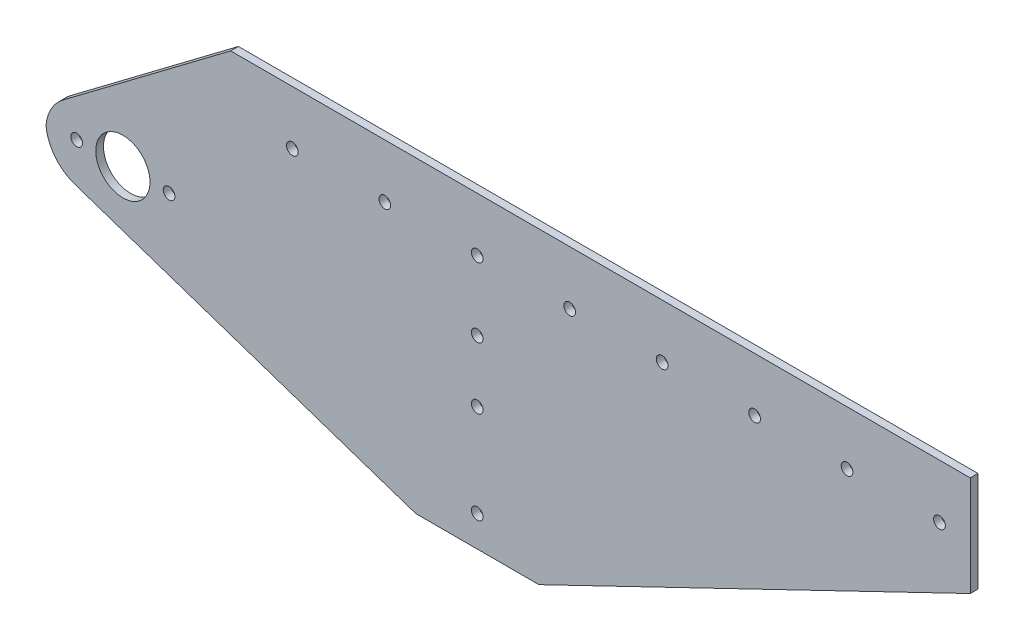
ISO-10303-21;
HEADER;
FILE_DESCRIPTION(('STEP AP214'),'2;1');
FILE_NAME('part.step','',(''),(''),'','','');
FILE_SCHEMA(('AUTOMOTIVE_DESIGN { 1 0 10303 214 1 1 1 1 }'));
ENDSEC;
DATA;
#1=APPLICATION_CONTEXT('core data for automotive mechanical design processes');
#2=APPLICATION_PROTOCOL_DEFINITION('international standard','automotive_design',2000,#1);
#3=PRODUCT_CONTEXT('',#1,'mechanical');
#4=PRODUCT('Part','Part','',(#3));
#5=PRODUCT_RELATED_PRODUCT_CATEGORY('part','',(#4));
#6=PRODUCT_DEFINITION_FORMATION('','',#4);
#7=PRODUCT_DEFINITION_CONTEXT('part definition',#1,'design');
#8=PRODUCT_DEFINITION('design','',#6,#7);
#9=PRODUCT_DEFINITION_SHAPE('','',#8);
#10=(LENGTH_UNIT() NAMED_UNIT(*) SI_UNIT(.MILLI.,.METRE.));
#11=(NAMED_UNIT(*) PLANE_ANGLE_UNIT() SI_UNIT($,.RADIAN.));
#12=(NAMED_UNIT(*) SI_UNIT($,.STERADIAN.) SOLID_ANGLE_UNIT());
#13=UNCERTAINTY_MEASURE_WITH_UNIT(LENGTH_MEASURE(1.E-05),#10,'distance_accuracy_value','');
#14=(GEOMETRIC_REPRESENTATION_CONTEXT(3) GLOBAL_UNCERTAINTY_ASSIGNED_CONTEXT((#13)) GLOBAL_UNIT_ASSIGNED_CONTEXT((#10,
#11,#12)) REPRESENTATION_CONTEXT('',''));
#15=CARTESIAN_POINT('',(0.,0.,0.));
#16=DIRECTION('',(0.,0.,1.));
#17=DIRECTION('',(1.,0.,0.));
#18=AXIS2_PLACEMENT_3D('',#15,#16,#17);
#19=CARTESIAN_POINT('',(-228.6,-127.,3.175));
#20=DIRECTION('',(0.318881014266664,0.947794755598628,0.));
#21=DIRECTION('',(-0.947794755598628,0.318881014266664,0.));
#22=AXIS2_PLACEMENT_3D('',#19,#20,#21);
#23=PLANE('',#22);
#24=DIRECTION('',(0.947794755598628,-0.318881014266664,0.));
#25=VECTOR('',#24,1.);
#26=CARTESIAN_POINT('',(-228.6,-127.,3.175));
#27=LINE('',#26,#25);
#28=CARTESIAN_POINT('',(-368.998683471379,-79.7635341696098,3.175));
#29=VERTEX_POINT('',#28);
#30=CARTESIAN_POINT('',(-228.6,-127.,3.175));
#31=VERTEX_POINT('',#30);
#32=EDGE_CURVE('E103',#29,#31,#27,.T.);
#33=ORIENTED_EDGE('',*,*,#32,.F.);
#34=DIRECTION('',(0.,0.,-1.));
#35=VECTOR('',#34,1.);
#36=CARTESIAN_POINT('',(-368.998683471379,-79.7635341696098,3.175));
#37=LINE('',#36,#35);
#38=CARTESIAN_POINT('',(-368.998683471379,-79.7635341696098,0.));
#39=VERTEX_POINT('',#38);
#40=EDGE_CURVE('E158',#29,#39,#37,.T.);
#41=ORIENTED_EDGE('',*,*,#40,.T.);
#42=DIRECTION('',(0.947794755598628,-0.318881014266664,0.));
#43=VECTOR('',#42,1.);
#44=CARTESIAN_POINT('',(-228.6,-127.,0.));
#45=LINE('',#44,#43);
#46=CARTESIAN_POINT('',(-228.6,-127.,0.));
#47=VERTEX_POINT('',#46);
#48=EDGE_CURVE('E118',#39,#47,#45,.T.);
#49=ORIENTED_EDGE('',*,*,#48,.T.);
#50=DIRECTION('',(0.,0.,-1.));
#51=VECTOR('',#50,1.);
#52=CARTESIAN_POINT('',(-228.6,-127.,3.175));
#53=LINE('',#52,#51);
#54=EDGE_CURVE('E116',#31,#47,#53,.T.);
#55=ORIENTED_EDGE('',*,*,#54,.F.);
#56=EDGE_LOOP('',(#33,#41,#49,#55));
#57=FACE_BOUND('',#56,.T.);
#58=ADVANCED_FACE('F39',(#57),#23,.F.);
#59=CARTESIAN_POINT('',(-177.8,-127.,3.175));
#60=DIRECTION('',(0.,1.,0.));
#61=DIRECTION('',(0.,0.,1.));
#62=AXIS2_PLACEMENT_3D('',#59,#60,#61);
#63=PLANE('',#62);
#64=DIRECTION('',(1.,0.,0.));
#65=VECTOR('',#64,1.);
#66=CARTESIAN_POINT('',(-177.8,-127.,0.));
#67=LINE('',#66,#65);
#68=CARTESIAN_POINT('',(-177.8,-127.,0.));
#69=VERTEX_POINT('',#68);
#70=EDGE_CURVE('E137',#47,#69,#67,.T.);
#71=ORIENTED_EDGE('',*,*,#70,.T.);
#72=DIRECTION('',(0.,0.,-1.));
#73=VECTOR('',#72,1.);
#74=CARTESIAN_POINT('',(-177.8,-127.,3.175));
#75=LINE('',#74,#73);
#76=CARTESIAN_POINT('',(-177.8,-127.,3.175));
#77=VERTEX_POINT('',#76);
#78=EDGE_CURVE('E122',#77,#69,#75,.T.);
#79=ORIENTED_EDGE('',*,*,#78,.F.);
#80=DIRECTION('',(1.,0.,0.));
#81=VECTOR('',#80,1.);
#82=CARTESIAN_POINT('',(-177.8,-127.,3.175));
#83=LINE('',#82,#81);
#84=EDGE_CURVE('E107',#31,#77,#83,.T.);
#85=ORIENTED_EDGE('',*,*,#84,.F.);
#86=ORIENTED_EDGE('',*,*,#54,.T.);
#87=EDGE_LOOP('',(#71,#79,#85,#86));
#88=FACE_BOUND('',#87,.T.);
#89=ADVANCED_FACE('F124',(#88),#63,.F.);
#90=CARTESIAN_POINT('',(0.,-41.275,3.175));
#91=DIRECTION('',(-0.434299185660003,0.900768681368895,0.));
#92=DIRECTION('',(-0.900768681368895,-0.434299185660003,0.));
#93=AXIS2_PLACEMENT_3D('',#90,#91,#92);
#94=PLANE('',#93);
#95=DIRECTION('',(0.900768681368895,0.434299185660003,0.));
#96=VECTOR('',#95,1.);
#97=CARTESIAN_POINT('',(0.,-41.275,0.));
#98=LINE('',#97,#96);
#99=CARTESIAN_POINT('',(0.,-41.275,0.));
#100=VERTEX_POINT('',#99);
#101=EDGE_CURVE('E140',#69,#100,#98,.T.);
#102=ORIENTED_EDGE('',*,*,#101,.T.);
#103=DIRECTION('',(0.,0.,-1.));
#104=VECTOR('',#103,1.);
#105=CARTESIAN_POINT('',(0.,-41.275,3.175));
#106=LINE('',#105,#104);
#107=CARTESIAN_POINT('',(0.,-41.275,3.175));
#108=VERTEX_POINT('',#107);
#109=EDGE_CURVE('E149',#108,#100,#106,.T.);
#110=ORIENTED_EDGE('',*,*,#109,.F.);
#111=DIRECTION('',(0.900768681368895,0.434299185660003,0.));
#112=VECTOR('',#111,1.);
#113=CARTESIAN_POINT('',(0.,-41.275,3.175));
#114=LINE('',#113,#112);
#115=EDGE_CURVE('E127',#77,#108,#114,.T.);
#116=ORIENTED_EDGE('',*,*,#115,.F.);
#117=ORIENTED_EDGE('',*,*,#78,.T.);
#118=EDGE_LOOP('',(#102,#110,#116,#117));
#119=FACE_BOUND('',#118,.T.);
#120=ADVANCED_FACE('F271',(#119),#94,.F.);
#121=CARTESIAN_POINT('',(0.,0.,3.175));
#122=DIRECTION('',(-1.,0.,0.));
#123=DIRECTION('',(0.,-1.,0.));
#124=AXIS2_PLACEMENT_3D('',#121,#122,#123);
#125=PLANE('',#124);
#126=DIRECTION('',(0.,1.,0.));
#127=VECTOR('',#126,1.);
#128=CARTESIAN_POINT('',(0.,0.,0.));
#129=LINE('',#128,#127);
#130=CARTESIAN_POINT('',(0.,0.,0.));
#131=VERTEX_POINT('',#130);
#132=EDGE_CURVE('E142',#100,#131,#129,.T.);
#133=ORIENTED_EDGE('',*,*,#132,.T.);
#134=DIRECTION('',(0.,0.,-1.));
#135=VECTOR('',#134,1.);
#136=CARTESIAN_POINT('',(0.,0.,3.175));
#137=LINE('',#136,#135);
#138=CARTESIAN_POINT('',(0.,0.,3.175));
#139=VERTEX_POINT('',#138);
#140=EDGE_CURVE('E135',#139,#131,#137,.T.);
#141=ORIENTED_EDGE('',*,*,#140,.F.);
#142=DIRECTION('',(0.,1.,0.));
#143=VECTOR('',#142,1.);
#144=CARTESIAN_POINT('',(0.,0.,3.175));
#145=LINE('',#144,#143);
#146=EDGE_CURVE('E129',#108,#139,#145,.T.);
#147=ORIENTED_EDGE('',*,*,#146,.F.);
#148=ORIENTED_EDGE('',*,*,#109,.T.);
#149=EDGE_LOOP('',(#133,#141,#147,#148));
#150=FACE_BOUND('',#149,.T.);
#151=ADVANCED_FACE('F268',(#150),#125,.F.);
#152=CARTESIAN_POINT('',(-304.8,0.,3.175));
#153=DIRECTION('',(0.,-1.,0.));
#154=DIRECTION('',(0.,0.,-1.));
#155=AXIS2_PLACEMENT_3D('',#152,#153,#154);
#156=PLANE('',#155);
#157=DIRECTION('',(-1.,0.,0.));
#158=VECTOR('',#157,1.);
#159=CARTESIAN_POINT('',(-304.8,0.,0.));
#160=LINE('',#159,#158);
#161=CARTESIAN_POINT('',(-304.8,0.,0.));
#162=VERTEX_POINT('',#161);
#163=EDGE_CURVE('E144',#131,#162,#160,.T.);
#164=ORIENTED_EDGE('',*,*,#163,.T.);
#165=DIRECTION('',(0.,0.,1.));
#166=VECTOR('',#165,1.);
#167=CARTESIAN_POINT('',(-304.8,0.,3.175));
#168=LINE('',#167,#166);
#169=CARTESIAN_POINT('',(-304.8,0.,3.175));
#170=VERTEX_POINT('',#169);
#171=EDGE_CURVE('E154',#162,#170,#168,.T.);
#172=ORIENTED_EDGE('',*,*,#171,.T.);
#173=DIRECTION('',(-1.,0.,0.));
#174=VECTOR('',#173,1.);
#175=CARTESIAN_POINT('',(-381.,0.,3.175));
#176=LINE('',#175,#174);
#177=EDGE_CURVE('E113',#139,#170,#176,.T.);
#178=ORIENTED_EDGE('',*,*,#177,.F.);
#179=ORIENTED_EDGE('',*,*,#140,.T.);
#180=EDGE_LOOP('',(#164,#172,#178,#179));
#181=FACE_BOUND('',#180,.T.);
#182=ADVANCED_FACE('F263',(#181),#156,.F.);
#183=CARTESIAN_POINT('',(0.,0.,3.175));
#184=DIRECTION('',(0.,0.,-1.));
#185=DIRECTION('',(-1.,0.,0.));
#186=AXIS2_PLACEMENT_3D('',#183,#184,#185);
#187=PLANE('',#186);
#188=CARTESIAN_POINT('',(-368.3,-63.5,3.175));
#189=DIRECTION('',(0.,0.,1.));
#190=DIRECTION('',(1.,0.,0.));
#191=AXIS2_PLACEMENT_3D('',#188,#189,#190);
#192=CIRCLE('',#191,2.41299999999999);
#193=CARTESIAN_POINT('',(-365.887,-63.5,3.175));
#194=VERTEX_POINT('',#193);
#195=EDGE_CURVE('E178',#194,#194,#192,.T.);
#196=ORIENTED_EDGE('',*,*,#195,.F.);
#197=EDGE_LOOP('',(#196));
#198=FACE_BOUND('',#197,.T.);
#199=CARTESIAN_POINT('',(-330.2,-63.5,3.175));
#200=DIRECTION('',(0.,0.,1.));
#201=DIRECTION('',(1.,0.,0.));
#202=AXIS2_PLACEMENT_3D('',#199,#200,#201);
#203=CIRCLE('',#202,2.41299999999999);
#204=CARTESIAN_POINT('',(-327.787,-63.5,3.175));
#205=VERTEX_POINT('',#204);
#206=EDGE_CURVE('E183',#205,#205,#203,.T.);
#207=ORIENTED_EDGE('',*,*,#206,.F.);
#208=EDGE_LOOP('',(#207));
#209=FACE_BOUND('',#208,.T.);
#210=CARTESIAN_POINT('',(-349.25,-63.5,3.175));
#211=DIRECTION('',(0.,0.,1.));
#212=DIRECTION('',(1.,0.,0.));
#213=AXIS2_PLACEMENT_3D('',#210,#211,#212);
#214=CIRCLE('',#213,11.176);
#215=CARTESIAN_POINT('',(-338.074,-63.5,3.175));
#216=VERTEX_POINT('',#215);
#217=EDGE_CURVE('E193',#216,#216,#214,.T.);
#218=ORIENTED_EDGE('',*,*,#217,.F.);
#219=EDGE_LOOP('',(#218));
#220=FACE_BOUND('',#219,.T.);
#221=CARTESIAN_POINT('',(-50.8,-22.2250000000004,3.175));
#222=DIRECTION('',(0.,0.,1.));
#223=DIRECTION('',(1.,0.,0.));
#224=AXIS2_PLACEMENT_3D('',#221,#222,#223);
#225=CIRCLE('',#224,2.413);
#226=CARTESIAN_POINT('',(-48.387,-22.2250000000004,3.175));
#227=VERTEX_POINT('',#226);
#228=EDGE_CURVE('E172',#227,#227,#225,.T.);
#229=ORIENTED_EDGE('',*,*,#228,.F.);
#230=EDGE_LOOP('',(#229));
#231=FACE_BOUND('',#230,.T.);
#232=CARTESIAN_POINT('',(-203.2,-114.3,3.175));
#233=DIRECTION('',(0.,0.,1.));
#234=DIRECTION('',(1.,0.,0.));
#235=AXIS2_PLACEMENT_3D('',#232,#233,#234);
#236=CIRCLE('',#235,2.41299999999999);
#237=CARTESIAN_POINT('',(-200.787,-114.3,3.175));
#238=VERTEX_POINT('',#237);
#239=EDGE_CURVE('E207',#238,#238,#236,.T.);
#240=ORIENTED_EDGE('',*,*,#239,.F.);
#241=EDGE_LOOP('',(#240));
#242=FACE_BOUND('',#241,.T.);
#243=CARTESIAN_POINT('',(-203.2,-76.2,3.175));
#244=DIRECTION('',(0.,0.,1.));
#245=DIRECTION('',(1.,0.,0.));
#246=AXIS2_PLACEMENT_3D('',#243,#244,#245);
#247=CIRCLE('',#246,2.41299999999999);
#248=CARTESIAN_POINT('',(-200.787,-76.2,3.175));
#249=VERTEX_POINT('',#248);
#250=EDGE_CURVE('E201',#249,#249,#247,.T.);
#251=ORIENTED_EDGE('',*,*,#250,.F.);
#252=EDGE_LOOP('',(#251));
#253=FACE_BOUND('',#252,.T.);
#254=CARTESIAN_POINT('',(-12.7,-22.2250000000001,3.175));
#255=DIRECTION('',(0.,0.,1.));
#256=DIRECTION('',(1.,0.,0.));
#257=AXIS2_PLACEMENT_3D('',#254,#255,#256);
#258=CIRCLE('',#257,2.413);
#259=CARTESIAN_POINT('',(-10.287,-22.2250000000001,3.175));
#260=VERTEX_POINT('',#259);
#261=EDGE_CURVE('E200',#260,#260,#258,.T.);
#262=ORIENTED_EDGE('',*,*,#261,.F.);
#263=EDGE_LOOP('',(#262));
#264=FACE_BOUND('',#263,.T.);
#265=CARTESIAN_POINT('',(-88.9,-22.2250000000006,3.175));
#266=DIRECTION('',(0.,0.,1.));
#267=DIRECTION('',(1.,0.,0.));
#268=AXIS2_PLACEMENT_3D('',#265,#266,#267);
#269=CIRCLE('',#268,2.41300000000001);
#270=CARTESIAN_POINT('',(-86.487,-22.2250000000006,3.175));
#271=VERTEX_POINT('',#270);
#272=EDGE_CURVE('E250',#271,#271,#269,.T.);
#273=ORIENTED_EDGE('',*,*,#272,.F.);
#274=EDGE_LOOP('',(#273));
#275=FACE_BOUND('',#274,.T.);
#276=CARTESIAN_POINT('',(-127.,-22.2250000000009,3.175));
#277=DIRECTION('',(0.,0.,1.));
#278=DIRECTION('',(1.,0.,0.));
#279=AXIS2_PLACEMENT_3D('',#276,#277,#278);
#280=CIRCLE('',#279,2.413);
#281=CARTESIAN_POINT('',(-124.587,-22.2250000000009,3.175));
#282=VERTEX_POINT('',#281);
#283=EDGE_CURVE('E244',#282,#282,#280,.T.);
#284=ORIENTED_EDGE('',*,*,#283,.F.);
#285=EDGE_LOOP('',(#284));
#286=FACE_BOUND('',#285,.T.);
#287=CARTESIAN_POINT('',(-165.1,-22.2250000000012,3.175));
#288=DIRECTION('',(0.,0.,1.));
#289=DIRECTION('',(1.,0.,0.));
#290=AXIS2_PLACEMENT_3D('',#287,#288,#289);
#291=CIRCLE('',#290,2.413);
#292=CARTESIAN_POINT('',(-162.687,-22.2250000000012,3.175));
#293=VERTEX_POINT('',#292);
#294=EDGE_CURVE('E238',#293,#293,#291,.T.);
#295=ORIENTED_EDGE('',*,*,#294,.F.);
#296=EDGE_LOOP('',(#295));
#297=FACE_BOUND('',#296,.T.);
#298=CARTESIAN_POINT('',(-203.2,-50.8,3.175));
#299=DIRECTION('',(0.,0.,1.));
#300=DIRECTION('',(1.,0.,0.));
#301=AXIS2_PLACEMENT_3D('',#298,#299,#300);
#302=CIRCLE('',#301,2.41299999999999);
#303=CARTESIAN_POINT('',(-200.787,-50.8,3.175));
#304=VERTEX_POINT('',#303);
#305=EDGE_CURVE('E232',#304,#304,#302,.T.);
#306=ORIENTED_EDGE('',*,*,#305,.F.);
#307=EDGE_LOOP('',(#306));
#308=FACE_BOUND('',#307,.T.);
#309=CARTESIAN_POINT('',(-203.2,-22.225,3.175));
#310=DIRECTION('',(0.,0.,1.));
#311=DIRECTION('',(1.,0.,0.));
#312=AXIS2_PLACEMENT_3D('',#309,#310,#311);
#313=CIRCLE('',#312,2.413);
#314=CARTESIAN_POINT('',(-200.787,-22.225,3.175));
#315=VERTEX_POINT('',#314);
#316=EDGE_CURVE('E226',#315,#315,#313,.T.);
#317=ORIENTED_EDGE('',*,*,#316,.F.);
#318=EDGE_LOOP('',(#317));
#319=FACE_BOUND('',#318,.T.);
#320=CARTESIAN_POINT('',(-241.3,-22.2250000000017,3.175));
#321=DIRECTION('',(0.,0.,1.));
#322=DIRECTION('',(1.,0.,0.));
#323=AXIS2_PLACEMENT_3D('',#320,#321,#322);
#324=CIRCLE('',#323,2.413);
#325=CARTESIAN_POINT('',(-238.887,-22.2250000000017,3.175));
#326=VERTEX_POINT('',#325);
#327=EDGE_CURVE('E220',#326,#326,#324,.T.);
#328=ORIENTED_EDGE('',*,*,#327,.F.);
#329=EDGE_LOOP('',(#328));
#330=FACE_BOUND('',#329,.T.);
#331=CARTESIAN_POINT('',(-279.4,-22.225000000002,3.175));
#332=DIRECTION('',(0.,0.,1.));
#333=DIRECTION('',(1.,0.,0.));
#334=AXIS2_PLACEMENT_3D('',#331,#332,#333);
#335=CIRCLE('',#334,2.413);
#336=CARTESIAN_POINT('',(-276.987,-22.225000000002,3.175));
#337=VERTEX_POINT('',#336);
#338=EDGE_CURVE('E214',#337,#337,#335,.T.);
#339=ORIENTED_EDGE('',*,*,#338,.F.);
#340=EDGE_LOOP('',(#339));
#341=FACE_BOUND('',#340,.T.);
#342=CARTESIAN_POINT('',(-363.38,-66.2058265517345,3.175));
#343=DIRECTION('',(0.,0.,-1.));
#344=DIRECTION('',(-1.,0.,0.));
#345=AXIS2_PLACEMENT_3D('',#342,#343,#344);
#346=CIRCLE('',#345,17.62);
#347=CARTESIAN_POINT('',(-373.983980707939,-52.1338688647011,3.175));
#348=VERTEX_POINT('',#347);
#349=CARTESIAN_POINT('',(-380.929805526972,-64.6346085638482,3.175));
#350=VERTEX_POINT('',#349);
#351=EDGE_CURVE('E55',#348,#350,#346,.F.);
#352=ORIENTED_EDGE('',*,*,#351,.T.);
#353=CARTESIAN_POINT('',(-363.38,-63.063390575962,3.175));
#354=DIRECTION('',(0.,0.,-1.));
#355=DIRECTION('',(-1.,0.,0.));
#356=AXIS2_PLACEMENT_3D('',#353,#354,#355);
#357=CIRCLE('',#356,17.62);
#358=EDGE_CURVE('E48',#350,#29,#357,.F.);
#359=ORIENTED_EDGE('',*,*,#358,.T.);
#360=ORIENTED_EDGE('',*,*,#32,.T.);
#361=ORIENTED_EDGE('',*,*,#84,.T.);
#362=ORIENTED_EDGE('',*,*,#115,.T.);
#363=ORIENTED_EDGE('',*,*,#146,.T.);
#364=ORIENTED_EDGE('',*,*,#177,.T.);
#365=DIRECTION('',(0.798635510047294,0.601815023152047,0.));
#366=VECTOR('',#365,1.);
#367=CARTESIAN_POINT('',(-381.,-57.420818617833,3.175));
#368=LINE('',#367,#366);
#369=EDGE_CURVE('E156',#170,#348,#368,.F.);
#370=ORIENTED_EDGE('',*,*,#369,.T.);
#371=EDGE_LOOP('',(#352,#359,#360,#361,#362,#363,#364,#370));
#372=FACE_BOUND('',#371,.T.);
#373=ADVANCED_FACE('F105',(#198,#209,#220,#231,#242,#253,#264,#275,#286,#297,#308,#319,#330,
#341,#372),#187,.F.);
#374=CARTESIAN_POINT('',(0.,0.,0.));
#375=DIRECTION('',(0.,0.,-1.));
#376=DIRECTION('',(-1.,0.,0.));
#377=AXIS2_PLACEMENT_3D('',#374,#375,#376);
#378=PLANE('',#377);
#379=CARTESIAN_POINT('',(-368.3,-63.5,0.));
#380=DIRECTION('',(0.,0.,1.));
#381=DIRECTION('',(1.,0.,0.));
#382=AXIS2_PLACEMENT_3D('',#379,#380,#381);
#383=CIRCLE('',#382,2.41299999999999);
#384=CARTESIAN_POINT('',(-365.887,-63.5,0.));
#385=VERTEX_POINT('',#384);
#386=EDGE_CURVE('E173',#385,#385,#383,.T.);
#387=ORIENTED_EDGE('',*,*,#386,.T.);
#388=EDGE_LOOP('',(#387));
#389=FACE_BOUND('',#388,.T.);
#390=CARTESIAN_POINT('',(-330.2,-63.5,0.));
#391=DIRECTION('',(0.,0.,1.));
#392=DIRECTION('',(1.,0.,0.));
#393=AXIS2_PLACEMENT_3D('',#390,#391,#392);
#394=CIRCLE('',#393,2.41299999999999);
#395=CARTESIAN_POINT('',(-327.787,-63.5,0.));
#396=VERTEX_POINT('',#395);
#397=EDGE_CURVE('E188',#396,#396,#394,.T.);
#398=ORIENTED_EDGE('',*,*,#397,.T.);
#399=EDGE_LOOP('',(#398));
#400=FACE_BOUND('',#399,.T.);
#401=CARTESIAN_POINT('',(-349.25,-63.5,0.));
#402=DIRECTION('',(0.,0.,1.));
#403=DIRECTION('',(1.,0.,0.));
#404=AXIS2_PLACEMENT_3D('',#401,#402,#403);
#405=CIRCLE('',#404,11.176);
#406=CARTESIAN_POINT('',(-338.074,-63.5,0.));
#407=VERTEX_POINT('',#406);
#408=EDGE_CURVE('E138',#407,#407,#405,.T.);
#409=ORIENTED_EDGE('',*,*,#408,.T.);
#410=EDGE_LOOP('',(#409));
#411=FACE_BOUND('',#410,.T.);
#412=CARTESIAN_POINT('',(-50.8,-22.2250000000004,0.));
#413=DIRECTION('',(0.,0.,1.));
#414=DIRECTION('',(1.,0.,0.));
#415=AXIS2_PLACEMENT_3D('',#412,#413,#414);
#416=CIRCLE('',#415,2.413);
#417=CARTESIAN_POINT('',(-48.387,-22.2250000000004,0.));
#418=VERTEX_POINT('',#417);
#419=EDGE_CURVE('E175',#418,#418,#416,.T.);
#420=ORIENTED_EDGE('',*,*,#419,.T.);
#421=EDGE_LOOP('',(#420));
#422=FACE_BOUND('',#421,.T.);
#423=CARTESIAN_POINT('',(-203.2,-114.3,0.));
#424=DIRECTION('',(0.,0.,1.));
#425=DIRECTION('',(1.,0.,0.));
#426=AXIS2_PLACEMENT_3D('',#423,#424,#425);
#427=CIRCLE('',#426,2.41299999999999);
#428=CARTESIAN_POINT('',(-200.787,-114.3,0.));
#429=VERTEX_POINT('',#428);
#430=EDGE_CURVE('E204',#429,#429,#427,.T.);
#431=ORIENTED_EDGE('',*,*,#430,.T.);
#432=EDGE_LOOP('',(#431));
#433=FACE_BOUND('',#432,.T.);
#434=CARTESIAN_POINT('',(-203.2,-76.2,0.));
#435=DIRECTION('',(0.,0.,1.));
#436=DIRECTION('',(1.,0.,0.));
#437=AXIS2_PLACEMENT_3D('',#434,#435,#436);
#438=CIRCLE('',#437,2.41299999999999);
#439=CARTESIAN_POINT('',(-200.787,-76.2,0.));
#440=VERTEX_POINT('',#439);
#441=EDGE_CURVE('E197',#440,#440,#438,.T.);
#442=ORIENTED_EDGE('',*,*,#441,.T.);
#443=EDGE_LOOP('',(#442));
#444=FACE_BOUND('',#443,.T.);
#445=CARTESIAN_POINT('',(-12.7,-22.2250000000001,0.));
#446=DIRECTION('',(0.,0.,1.));
#447=DIRECTION('',(1.,0.,0.));
#448=AXIS2_PLACEMENT_3D('',#445,#446,#447);
#449=CIRCLE('',#448,2.413);
#450=CARTESIAN_POINT('',(-10.287,-22.2250000000001,0.));
#451=VERTEX_POINT('',#450);
#452=EDGE_CURVE('E253',#451,#451,#449,.T.);
#453=ORIENTED_EDGE('',*,*,#452,.T.);
#454=EDGE_LOOP('',(#453));
#455=FACE_BOUND('',#454,.T.);
#456=CARTESIAN_POINT('',(-88.9,-22.2250000000006,0.));
#457=DIRECTION('',(0.,0.,1.));
#458=DIRECTION('',(1.,0.,0.));
#459=AXIS2_PLACEMENT_3D('',#456,#457,#458);
#460=CIRCLE('',#459,2.41300000000001);
#461=CARTESIAN_POINT('',(-86.487,-22.2250000000006,0.));
#462=VERTEX_POINT('',#461);
#463=EDGE_CURVE('E247',#462,#462,#460,.T.);
#464=ORIENTED_EDGE('',*,*,#463,.T.);
#465=EDGE_LOOP('',(#464));
#466=FACE_BOUND('',#465,.T.);
#467=CARTESIAN_POINT('',(-127.,-22.2250000000009,0.));
#468=DIRECTION('',(0.,0.,1.));
#469=DIRECTION('',(1.,0.,0.));
#470=AXIS2_PLACEMENT_3D('',#467,#468,#469);
#471=CIRCLE('',#470,2.413);
#472=CARTESIAN_POINT('',(-124.587,-22.2250000000009,0.));
#473=VERTEX_POINT('',#472);
#474=EDGE_CURVE('E241',#473,#473,#471,.T.);
#475=ORIENTED_EDGE('',*,*,#474,.T.);
#476=EDGE_LOOP('',(#475));
#477=FACE_BOUND('',#476,.T.);
#478=CARTESIAN_POINT('',(-165.1,-22.2250000000012,0.));
#479=DIRECTION('',(0.,0.,1.));
#480=DIRECTION('',(1.,0.,0.));
#481=AXIS2_PLACEMENT_3D('',#478,#479,#480);
#482=CIRCLE('',#481,2.413);
#483=CARTESIAN_POINT('',(-162.687,-22.2250000000012,0.));
#484=VERTEX_POINT('',#483);
#485=EDGE_CURVE('E235',#484,#484,#482,.T.);
#486=ORIENTED_EDGE('',*,*,#485,.T.);
#487=EDGE_LOOP('',(#486));
#488=FACE_BOUND('',#487,.T.);
#489=CARTESIAN_POINT('',(-203.2,-50.8,0.));
#490=DIRECTION('',(0.,0.,1.));
#491=DIRECTION('',(1.,0.,0.));
#492=AXIS2_PLACEMENT_3D('',#489,#490,#491);
#493=CIRCLE('',#492,2.41299999999999);
#494=CARTESIAN_POINT('',(-200.787,-50.8,0.));
#495=VERTEX_POINT('',#494);
#496=EDGE_CURVE('E229',#495,#495,#493,.T.);
#497=ORIENTED_EDGE('',*,*,#496,.T.);
#498=EDGE_LOOP('',(#497));
#499=FACE_BOUND('',#498,.T.);
#500=CARTESIAN_POINT('',(-203.2,-22.225,0.));
#501=DIRECTION('',(0.,0.,1.));
#502=DIRECTION('',(1.,0.,0.));
#503=AXIS2_PLACEMENT_3D('',#500,#501,#502);
#504=CIRCLE('',#503,2.413);
#505=CARTESIAN_POINT('',(-200.787,-22.225,0.));
#506=VERTEX_POINT('',#505);
#507=EDGE_CURVE('E223',#506,#506,#504,.T.);
#508=ORIENTED_EDGE('',*,*,#507,.T.);
#509=EDGE_LOOP('',(#508));
#510=FACE_BOUND('',#509,.T.);
#511=CARTESIAN_POINT('',(-241.3,-22.2250000000017,0.));
#512=DIRECTION('',(0.,0.,1.));
#513=DIRECTION('',(1.,0.,0.));
#514=AXIS2_PLACEMENT_3D('',#511,#512,#513);
#515=CIRCLE('',#514,2.413);
#516=CARTESIAN_POINT('',(-238.887,-22.2250000000017,0.));
#517=VERTEX_POINT('',#516);
#518=EDGE_CURVE('E217',#517,#517,#515,.T.);
#519=ORIENTED_EDGE('',*,*,#518,.T.);
#520=EDGE_LOOP('',(#519));
#521=FACE_BOUND('',#520,.T.);
#522=CARTESIAN_POINT('',(-279.4,-22.225000000002,0.));
#523=DIRECTION('',(0.,0.,1.));
#524=DIRECTION('',(1.,0.,0.));
#525=AXIS2_PLACEMENT_3D('',#522,#523,#524);
#526=CIRCLE('',#525,2.413);
#527=CARTESIAN_POINT('',(-276.987,-22.225000000002,0.));
#528=VERTEX_POINT('',#527);
#529=EDGE_CURVE('E196',#528,#528,#526,.T.);
#530=ORIENTED_EDGE('',*,*,#529,.T.);
#531=EDGE_LOOP('',(#530));
#532=FACE_BOUND('',#531,.T.);
#533=ORIENTED_EDGE('',*,*,#48,.F.);
#534=CARTESIAN_POINT('',(-363.38,-63.063390575962,0.));
#535=DIRECTION('',(0.,0.,-1.));
#536=DIRECTION('',(-1.,0.,0.));
#537=AXIS2_PLACEMENT_3D('',#534,#535,#536);
#538=CIRCLE('',#537,17.62);
#539=CARTESIAN_POINT('',(-380.929805526972,-64.6346085638482,0.));
#540=VERTEX_POINT('',#539);
#541=EDGE_CURVE('E162',#39,#540,#538,.T.);
#542=ORIENTED_EDGE('',*,*,#541,.T.);
#543=CARTESIAN_POINT('',(-363.38,-66.2058265517345,0.));
#544=DIRECTION('',(0.,0.,-1.));
#545=DIRECTION('',(-1.,0.,0.));
#546=AXIS2_PLACEMENT_3D('',#543,#544,#545);
#547=CIRCLE('',#546,17.62);
#548=CARTESIAN_POINT('',(-373.983980707939,-52.1338688647012,0.));
#549=VERTEX_POINT('',#548);
#550=EDGE_CURVE('E160',#540,#549,#547,.T.);
#551=ORIENTED_EDGE('',*,*,#550,.T.);
#552=DIRECTION('',(-0.798635510047294,-0.601815023152047,0.));
#553=VECTOR('',#552,1.);
#554=CARTESIAN_POINT('',(-110.392866973489,146.496282460999,0.));
#555=LINE('',#554,#553);
#556=EDGE_CURVE('E121',#549,#162,#555,.F.);
#557=ORIENTED_EDGE('',*,*,#556,.T.);
#558=ORIENTED_EDGE('',*,*,#163,.F.);
#559=ORIENTED_EDGE('',*,*,#132,.F.);
#560=ORIENTED_EDGE('',*,*,#101,.F.);
#561=ORIENTED_EDGE('',*,*,#70,.F.);
#562=EDGE_LOOP('',(#533,#542,#551,#557,#558,#559,#560,#561));
#563=FACE_BOUND('',#562,.T.);
#564=ADVANCED_FACE('F167',(#389,#400,#411,#422,#433,#444,#455,#466,#477,#488,#499,#510,#521,
#532,#563),#378,.T.);
#565=CARTESIAN_POINT('',(-279.4,-22.225000000002,0.));
#566=DIRECTION('',(0.,0.,1.));
#567=DIRECTION('',(1.,0.,0.));
#568=AXIS2_PLACEMENT_3D('',#565,#566,#567);
#569=CYLINDRICAL_SURFACE('',#568,2.413);
#570=ORIENTED_EDGE('',*,*,#529,.F.);
#571=EDGE_LOOP('',(#570));
#572=FACE_BOUND('',#571,.T.);
#573=ORIENTED_EDGE('',*,*,#338,.T.);
#574=EDGE_LOOP('',(#573));
#575=FACE_BOUND('',#574,.T.);
#576=ADVANCED_FACE('F392',(#572,#575),#569,.F.);
#577=CARTESIAN_POINT('',(-241.3,-22.2250000000017,0.));
#578=DIRECTION('',(0.,0.,1.));
#579=DIRECTION('',(1.,0.,0.));
#580=AXIS2_PLACEMENT_3D('',#577,#578,#579);
#581=CYLINDRICAL_SURFACE('',#580,2.413);
#582=ORIENTED_EDGE('',*,*,#518,.F.);
#583=EDGE_LOOP('',(#582));
#584=FACE_BOUND('',#583,.T.);
#585=ORIENTED_EDGE('',*,*,#327,.T.);
#586=EDGE_LOOP('',(#585));
#587=FACE_BOUND('',#586,.T.);
#588=ADVANCED_FACE('F384',(#584,#587),#581,.F.);
#589=CARTESIAN_POINT('',(-203.2,-22.225,0.));
#590=DIRECTION('',(0.,0.,1.));
#591=DIRECTION('',(1.,0.,0.));
#592=AXIS2_PLACEMENT_3D('',#589,#590,#591);
#593=CYLINDRICAL_SURFACE('',#592,2.413);
#594=ORIENTED_EDGE('',*,*,#507,.F.);
#595=EDGE_LOOP('',(#594));
#596=FACE_BOUND('',#595,.T.);
#597=ORIENTED_EDGE('',*,*,#316,.T.);
#598=EDGE_LOOP('',(#597));
#599=FACE_BOUND('',#598,.T.);
#600=ADVANCED_FACE('F376',(#596,#599),#593,.F.);
#601=CARTESIAN_POINT('',(-203.2,-50.8,0.));
#602=DIRECTION('',(0.,0.,1.));
#603=DIRECTION('',(1.,0.,0.));
#604=AXIS2_PLACEMENT_3D('',#601,#602,#603);
#605=CYLINDRICAL_SURFACE('',#604,2.41299999999999);
#606=ORIENTED_EDGE('',*,*,#496,.F.);
#607=EDGE_LOOP('',(#606));
#608=FACE_BOUND('',#607,.T.);
#609=ORIENTED_EDGE('',*,*,#305,.T.);
#610=EDGE_LOOP('',(#609));
#611=FACE_BOUND('',#610,.T.);
#612=ADVANCED_FACE('F368',(#608,#611),#605,.F.);
#613=CARTESIAN_POINT('',(-165.1,-22.2250000000012,0.));
#614=DIRECTION('',(0.,0.,1.));
#615=DIRECTION('',(1.,0.,0.));
#616=AXIS2_PLACEMENT_3D('',#613,#614,#615);
#617=CYLINDRICAL_SURFACE('',#616,2.413);
#618=ORIENTED_EDGE('',*,*,#485,.F.);
#619=EDGE_LOOP('',(#618));
#620=FACE_BOUND('',#619,.T.);
#621=ORIENTED_EDGE('',*,*,#294,.T.);
#622=EDGE_LOOP('',(#621));
#623=FACE_BOUND('',#622,.T.);
#624=ADVANCED_FACE('F360',(#620,#623),#617,.F.);
#625=CARTESIAN_POINT('',(-127.,-22.2250000000009,0.));
#626=DIRECTION('',(0.,0.,1.));
#627=DIRECTION('',(1.,0.,0.));
#628=AXIS2_PLACEMENT_3D('',#625,#626,#627);
#629=CYLINDRICAL_SURFACE('',#628,2.413);
#630=ORIENTED_EDGE('',*,*,#474,.F.);
#631=EDGE_LOOP('',(#630));
#632=FACE_BOUND('',#631,.T.);
#633=ORIENTED_EDGE('',*,*,#283,.T.);
#634=EDGE_LOOP('',(#633));
#635=FACE_BOUND('',#634,.T.);
#636=ADVANCED_FACE('F352',(#632,#635),#629,.F.);
#637=CARTESIAN_POINT('',(-88.9,-22.2250000000006,0.));
#638=DIRECTION('',(0.,0.,1.));
#639=DIRECTION('',(1.,0.,0.));
#640=AXIS2_PLACEMENT_3D('',#637,#638,#639);
#641=CYLINDRICAL_SURFACE('',#640,2.41300000000001);
#642=ORIENTED_EDGE('',*,*,#463,.F.);
#643=EDGE_LOOP('',(#642));
#644=FACE_BOUND('',#643,.T.);
#645=ORIENTED_EDGE('',*,*,#272,.T.);
#646=EDGE_LOOP('',(#645));
#647=FACE_BOUND('',#646,.T.);
#648=ADVANCED_FACE('F344',(#644,#647),#641,.F.);
#649=CARTESIAN_POINT('',(-12.7,-22.2250000000001,0.));
#650=DIRECTION('',(0.,0.,1.));
#651=DIRECTION('',(1.,0.,0.));
#652=AXIS2_PLACEMENT_3D('',#649,#650,#651);
#653=CYLINDRICAL_SURFACE('',#652,2.413);
#654=ORIENTED_EDGE('',*,*,#452,.F.);
#655=EDGE_LOOP('',(#654));
#656=FACE_BOUND('',#655,.T.);
#657=ORIENTED_EDGE('',*,*,#261,.T.);
#658=EDGE_LOOP('',(#657));
#659=FACE_BOUND('',#658,.T.);
#660=ADVANCED_FACE('F336',(#656,#659),#653,.F.);
#661=CARTESIAN_POINT('',(-203.2,-76.2,0.));
#662=DIRECTION('',(0.,0.,1.));
#663=DIRECTION('',(1.,0.,0.));
#664=AXIS2_PLACEMENT_3D('',#661,#662,#663);
#665=CYLINDRICAL_SURFACE('',#664,2.41299999999999);
#666=ORIENTED_EDGE('',*,*,#441,.F.);
#667=EDGE_LOOP('',(#666));
#668=FACE_BOUND('',#667,.T.);
#669=ORIENTED_EDGE('',*,*,#250,.T.);
#670=EDGE_LOOP('',(#669));
#671=FACE_BOUND('',#670,.T.);
#672=ADVANCED_FACE('F328',(#668,#671),#665,.F.);
#673=CARTESIAN_POINT('',(-203.2,-114.3,0.));
#674=DIRECTION('',(0.,0.,1.));
#675=DIRECTION('',(1.,0.,0.));
#676=AXIS2_PLACEMENT_3D('',#673,#674,#675);
#677=CYLINDRICAL_SURFACE('',#676,2.41299999999999);
#678=ORIENTED_EDGE('',*,*,#430,.F.);
#679=EDGE_LOOP('',(#678));
#680=FACE_BOUND('',#679,.T.);
#681=ORIENTED_EDGE('',*,*,#239,.T.);
#682=EDGE_LOOP('',(#681));
#683=FACE_BOUND('',#682,.T.);
#684=ADVANCED_FACE('F320',(#680,#683),#677,.F.);
#685=CARTESIAN_POINT('',(-50.8,-22.2250000000004,0.));
#686=DIRECTION('',(0.,0.,1.));
#687=DIRECTION('',(1.,0.,0.));
#688=AXIS2_PLACEMENT_3D('',#685,#686,#687);
#689=CYLINDRICAL_SURFACE('',#688,2.413);
#690=ORIENTED_EDGE('',*,*,#419,.F.);
#691=EDGE_LOOP('',(#690));
#692=FACE_BOUND('',#691,.T.);
#693=ORIENTED_EDGE('',*,*,#228,.T.);
#694=EDGE_LOOP('',(#693));
#695=FACE_BOUND('',#694,.T.);
#696=ADVANCED_FACE('F311',(#692,#695),#689,.F.);
#697=CARTESIAN_POINT('',(-349.25,-63.5,0.));
#698=DIRECTION('',(0.,0.,1.));
#699=DIRECTION('',(1.,0.,0.));
#700=AXIS2_PLACEMENT_3D('',#697,#698,#699);
#701=CYLINDRICAL_SURFACE('',#700,11.176);
#702=ORIENTED_EDGE('',*,*,#408,.F.);
#703=EDGE_LOOP('',(#702));
#704=FACE_BOUND('',#703,.T.);
#705=ORIENTED_EDGE('',*,*,#217,.T.);
#706=EDGE_LOOP('',(#705));
#707=FACE_BOUND('',#706,.T.);
#708=ADVANCED_FACE('F289',(#704,#707),#701,.F.);
#709=CARTESIAN_POINT('',(-381.,-57.420818617833,3.175));
#710=DIRECTION('',(0.601815023152047,-0.798635510047294,0.));
#711=DIRECTION('',(0.,0.,-1.));
#712=AXIS2_PLACEMENT_3D('',#709,#710,#711);
#713=PLANE('',#712);
#714=ORIENTED_EDGE('',*,*,#556,.F.);
#715=DIRECTION('',(0.,0.,-1.));
#716=VECTOR('',#715,1.);
#717=CARTESIAN_POINT('',(-373.983980707939,-52.1338688647011,3.175));
#718=LINE('',#717,#716);
#719=EDGE_CURVE('E11',#549,#348,#718,.F.);
#720=ORIENTED_EDGE('',*,*,#719,.T.);
#721=ORIENTED_EDGE('',*,*,#369,.F.);
#722=ORIENTED_EDGE('',*,*,#171,.F.);
#723=EDGE_LOOP('',(#714,#720,#721,#722));
#724=FACE_BOUND('',#723,.T.);
#725=ADVANCED_FACE('F262',(#724),#713,.F.);
#726=CARTESIAN_POINT('',(-363.38,-66.2058265517345,3.175));
#727=DIRECTION('',(0.,0.,-1.));
#728=DIRECTION('',(-1.,0.,0.));
#729=AXIS2_PLACEMENT_3D('',#726,#727,#728);
#730=CYLINDRICAL_SURFACE('',#729,17.62);
#731=DIRECTION('',(0.,0.,-1.));
#732=VECTOR('',#731,1.);
#733=CARTESIAN_POINT('',(-380.929805526972,-64.6346085638482,1.5875));
#734=LINE('',#733,#732);
#735=EDGE_CURVE('E43',#350,#540,#734,.T.);
#736=ORIENTED_EDGE('',*,*,#735,.F.);
#737=ORIENTED_EDGE('',*,*,#351,.F.);
#738=ORIENTED_EDGE('',*,*,#719,.F.);
#739=ORIENTED_EDGE('',*,*,#550,.F.);
#740=EDGE_LOOP('',(#736,#737,#738,#739));
#741=FACE_BOUND('',#740,.T.);
#742=ADVANCED_FACE('F41',(#741),#730,.T.);
#743=CARTESIAN_POINT('',(-363.38,-63.063390575962,3.175));
#744=DIRECTION('',(0.,0.,-1.));
#745=DIRECTION('',(-1.,0.,0.));
#746=AXIS2_PLACEMENT_3D('',#743,#744,#745);
#747=CYLINDRICAL_SURFACE('',#746,17.62);
#748=ORIENTED_EDGE('',*,*,#358,.F.);
#749=ORIENTED_EDGE('',*,*,#735,.T.);
#750=ORIENTED_EDGE('',*,*,#541,.F.);
#751=ORIENTED_EDGE('',*,*,#40,.F.);
#752=EDGE_LOOP('',(#748,#749,#750,#751));
#753=FACE_BOUND('',#752,.T.);
#754=ADVANCED_FACE('F171',(#753),#747,.T.);
#755=CARTESIAN_POINT('',(-330.2,-63.5,0.));
#756=DIRECTION('',(0.,0.,1.));
#757=DIRECTION('',(1.,0.,0.));
#758=AXIS2_PLACEMENT_3D('',#755,#756,#757);
#759=CYLINDRICAL_SURFACE('',#758,2.41299999999999);
#760=ORIENTED_EDGE('',*,*,#397,.F.);
#761=EDGE_LOOP('',(#760));
#762=FACE_BOUND('',#761,.T.);
#763=ORIENTED_EDGE('',*,*,#206,.T.);
#764=EDGE_LOOP('',(#763));
#765=FACE_BOUND('',#764,.T.);
#766=ADVANCED_FACE('F291',(#762,#765),#759,.F.);
#767=CARTESIAN_POINT('',(-368.3,-63.5,0.));
#768=DIRECTION('',(0.,0.,1.));
#769=DIRECTION('',(1.,0.,0.));
#770=AXIS2_PLACEMENT_3D('',#767,#768,#769);
#771=CYLINDRICAL_SURFACE('',#770,2.41299999999999);
#772=ORIENTED_EDGE('',*,*,#386,.F.);
#773=EDGE_LOOP('',(#772));
#774=FACE_BOUND('',#773,.T.);
#775=ORIENTED_EDGE('',*,*,#195,.T.);
#776=EDGE_LOOP('',(#775));
#777=FACE_BOUND('',#776,.T.);
#778=ADVANCED_FACE('F296',(#774,#777),#771,.F.);
#779=CLOSED_SHELL('',(#58,#89,#120,#151,#182,#373,#564,#576,#588,#600,#612,#624,#636,#648,#660,
#672,#684,#696,#708,#725,#742,#754,#766,#778));
#780=MANIFOLD_SOLID_BREP('B2',#779);
#781=ADVANCED_BREP_SHAPE_REPRESENTATION('',(#18,#780),#14);
#782=SHAPE_DEFINITION_REPRESENTATION(#9,#781);
ENDSEC;
END-ISO-10303-21;
